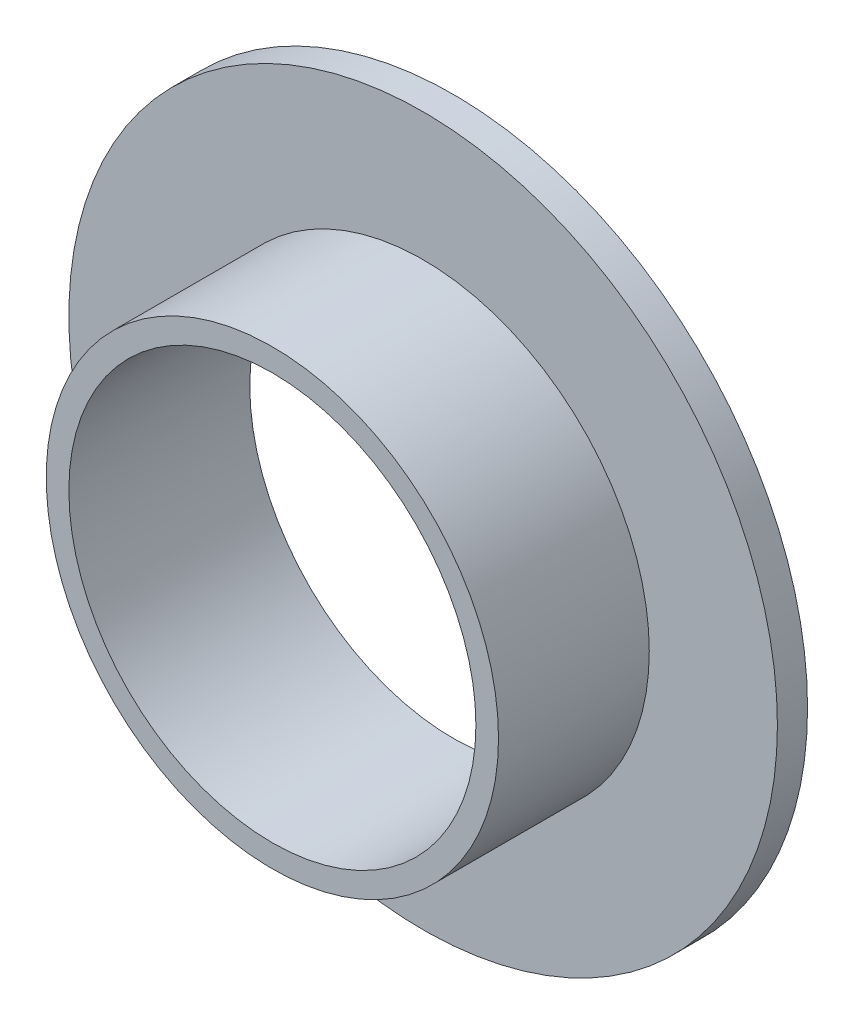
ISO-10303-21;
HEADER;
FILE_DESCRIPTION(('STEP AP214'),'2;1');
FILE_NAME('part.step','',(''),(''),'','','');
FILE_SCHEMA(('AUTOMOTIVE_DESIGN { 1 0 10303 214 1 1 1 1 }'));
ENDSEC;
DATA;
#1=APPLICATION_CONTEXT('core data for automotive mechanical design processes');
#2=APPLICATION_PROTOCOL_DEFINITION('international standard','automotive_design',2000,#1);
#3=PRODUCT_CONTEXT('',#1,'mechanical');
#4=PRODUCT('Part','Part','',(#3));
#5=PRODUCT_RELATED_PRODUCT_CATEGORY('part','',(#4));
#6=PRODUCT_DEFINITION_FORMATION('','',#4);
#7=PRODUCT_DEFINITION_CONTEXT('part definition',#1,'design');
#8=PRODUCT_DEFINITION('design','',#6,#7);
#9=PRODUCT_DEFINITION_SHAPE('','',#8);
#10=(LENGTH_UNIT() NAMED_UNIT(*) SI_UNIT(.MILLI.,.METRE.));
#11=(NAMED_UNIT(*) PLANE_ANGLE_UNIT() SI_UNIT($,.RADIAN.));
#12=(NAMED_UNIT(*) SI_UNIT($,.STERADIAN.) SOLID_ANGLE_UNIT());
#13=UNCERTAINTY_MEASURE_WITH_UNIT(LENGTH_MEASURE(1.E-05),#10,'distance_accuracy_value','');
#14=(GEOMETRIC_REPRESENTATION_CONTEXT(3) GLOBAL_UNCERTAINTY_ASSIGNED_CONTEXT((#13)) GLOBAL_UNIT_ASSIGNED_CONTEXT((#10,
#11,#12)) REPRESENTATION_CONTEXT('',''));
#15=CARTESIAN_POINT('',(0.,0.,0.));
#16=DIRECTION('',(0.,0.,1.));
#17=DIRECTION('',(1.,0.,0.));
#18=AXIS2_PLACEMENT_3D('',#15,#16,#17);
#19=CARTESIAN_POINT('',(0.,0.,2.));
#20=DIRECTION('',(0.,0.,-1.));
#21=DIRECTION('',(-1.,0.,0.));
#22=AXIS2_PLACEMENT_3D('',#19,#20,#21);
#23=CYLINDRICAL_SURFACE('',#22,23.5);
#24=CARTESIAN_POINT('',(0.,0.,2.));
#25=DIRECTION('',(0.,0.,1.));
#26=DIRECTION('',(1.,0.,0.));
#27=AXIS2_PLACEMENT_3D('',#24,#25,#26);
#28=CIRCLE('',#27,23.5);
#29=CARTESIAN_POINT('',(23.5,0.,2.));
#30=VERTEX_POINT('',#29);
#31=EDGE_CURVE('E10',#30,#30,#28,.T.);
#32=ORIENTED_EDGE('',*,*,#31,.F.);
#33=EDGE_LOOP('',(#32));
#34=FACE_BOUND('',#33,.T.);
#35=CARTESIAN_POINT('',(0.,0.,0.));
#36=DIRECTION('',(0.,0.,1.));
#37=DIRECTION('',(1.,0.,0.));
#38=AXIS2_PLACEMENT_3D('',#35,#36,#37);
#39=CIRCLE('',#38,23.5);
#40=CARTESIAN_POINT('',(23.5,0.,0.));
#41=VERTEX_POINT('',#40);
#42=EDGE_CURVE('E40',#41,#41,#39,.T.);
#43=ORIENTED_EDGE('',*,*,#42,.T.);
#44=EDGE_LOOP('',(#43));
#45=FACE_BOUND('',#44,.T.);
#46=ADVANCED_FACE('F37',(#34,#45),#23,.T.);
#47=CARTESIAN_POINT('',(0.,0.,2.));
#48=DIRECTION('',(0.,0.,1.));
#49=DIRECTION('',(1.,0.,0.));
#50=AXIS2_PLACEMENT_3D('',#47,#48,#49);
#51=PLANE('',#50);
#52=CARTESIAN_POINT('',(0.,0.,2.));
#53=DIRECTION('',(0.,0.,1.));
#54=DIRECTION('',(1.,0.,0.));
#55=AXIS2_PLACEMENT_3D('',#52,#53,#54);
#56=CIRCLE('',#55,15.);
#57=CARTESIAN_POINT('',(15.,0.,2.));
#58=VERTEX_POINT('',#57);
#59=EDGE_CURVE('E51',#58,#58,#56,.T.);
#60=ORIENTED_EDGE('',*,*,#59,.F.);
#61=EDGE_LOOP('',(#60));
#62=FACE_BOUND('',#61,.T.);
#63=ORIENTED_EDGE('',*,*,#31,.T.);
#64=EDGE_LOOP('',(#63));
#65=FACE_BOUND('',#64,.T.);
#66=ADVANCED_FACE('F74',(#62,#65),#51,.T.);
#67=CARTESIAN_POINT('',(0.,0.,0.));
#68=DIRECTION('',(0.,0.,1.));
#69=DIRECTION('',(1.,0.,0.));
#70=AXIS2_PLACEMENT_3D('',#67,#68,#69);
#71=PLANE('',#70);
#72=CARTESIAN_POINT('',(0.,0.,0.));
#73=DIRECTION('',(0.,0.,-1.));
#74=DIRECTION('',(-1.,0.,0.));
#75=AXIS2_PLACEMENT_3D('',#72,#73,#74);
#76=CIRCLE('',#75,13.5);
#77=CARTESIAN_POINT('',(-13.5,0.,0.));
#78=VERTEX_POINT('',#77);
#79=EDGE_CURVE('E62',#78,#78,#76,.T.);
#80=ORIENTED_EDGE('',*,*,#79,.F.);
#81=EDGE_LOOP('',(#80));
#82=FACE_BOUND('',#81,.T.);
#83=ORIENTED_EDGE('',*,*,#42,.F.);
#84=EDGE_LOOP('',(#83));
#85=FACE_BOUND('',#84,.T.);
#86=ADVANCED_FACE('F70',(#82,#85),#71,.F.);
#87=CARTESIAN_POINT('',(0.,0.,12.));
#88=DIRECTION('',(0.,0.,1.));
#89=DIRECTION('',(1.,0.,0.));
#90=AXIS2_PLACEMENT_3D('',#87,#88,#89);
#91=PLANE('',#90);
#92=CARTESIAN_POINT('',(0.,0.,12.));
#93=DIRECTION('',(0.,0.,1.));
#94=DIRECTION('',(1.,0.,0.));
#95=AXIS2_PLACEMENT_3D('',#92,#93,#94);
#96=CIRCLE('',#95,15.);
#97=CARTESIAN_POINT('',(15.,0.,12.));
#98=VERTEX_POINT('',#97);
#99=EDGE_CURVE('E49',#98,#98,#96,.T.);
#100=ORIENTED_EDGE('',*,*,#99,.T.);
#101=EDGE_LOOP('',(#100));
#102=FACE_BOUND('',#101,.T.);
#103=CARTESIAN_POINT('',(0.,0.,12.));
#104=DIRECTION('',(0.,0.,1.));
#105=DIRECTION('',(1.,0.,0.));
#106=AXIS2_PLACEMENT_3D('',#103,#104,#105);
#107=CIRCLE('',#106,13.5);
#108=CARTESIAN_POINT('',(13.5,0.,12.));
#109=VERTEX_POINT('',#108);
#110=EDGE_CURVE('E55',#109,#109,#107,.T.);
#111=ORIENTED_EDGE('',*,*,#110,.F.);
#112=EDGE_LOOP('',(#111));
#113=FACE_BOUND('',#112,.T.);
#114=ADVANCED_FACE('F73',(#102,#113),#91,.T.);
#115=CARTESIAN_POINT('',(0.,0.,12.));
#116=DIRECTION('',(0.,0.,-1.));
#117=DIRECTION('',(-1.,0.,0.));
#118=AXIS2_PLACEMENT_3D('',#115,#116,#117);
#119=CYLINDRICAL_SURFACE('',#118,15.);
#120=ORIENTED_EDGE('',*,*,#99,.F.);
#121=EDGE_LOOP('',(#120));
#122=FACE_BOUND('',#121,.T.);
#123=ORIENTED_EDGE('',*,*,#59,.T.);
#124=EDGE_LOOP('',(#123));
#125=FACE_BOUND('',#124,.T.);
#126=ADVANCED_FACE('F88',(#122,#125),#119,.T.);
#127=CARTESIAN_POINT('',(0.,0.,12.));
#128=DIRECTION('',(0.,0.,-1.));
#129=DIRECTION('',(-1.,0.,0.));
#130=AXIS2_PLACEMENT_3D('',#127,#128,#129);
#131=CYLINDRICAL_SURFACE('',#130,13.5);
#132=ORIENTED_EDGE('',*,*,#79,.T.);
#133=EDGE_LOOP('',(#132));
#134=FACE_BOUND('',#133,.T.);
#135=ORIENTED_EDGE('',*,*,#110,.T.);
#136=EDGE_LOOP('',(#135));
#137=FACE_BOUND('',#136,.T.);
#138=ADVANCED_FACE('F67',(#134,#137),#131,.F.);
#139=CLOSED_SHELL('',(#46,#66,#86,#114,#126,#138));
#140=MANIFOLD_SOLID_BREP('B2',#139);
#141=ADVANCED_BREP_SHAPE_REPRESENTATION('',(#18,#140),#14);
#142=SHAPE_DEFINITION_REPRESENTATION(#9,#141);
ENDSEC;
END-ISO-10303-21;
